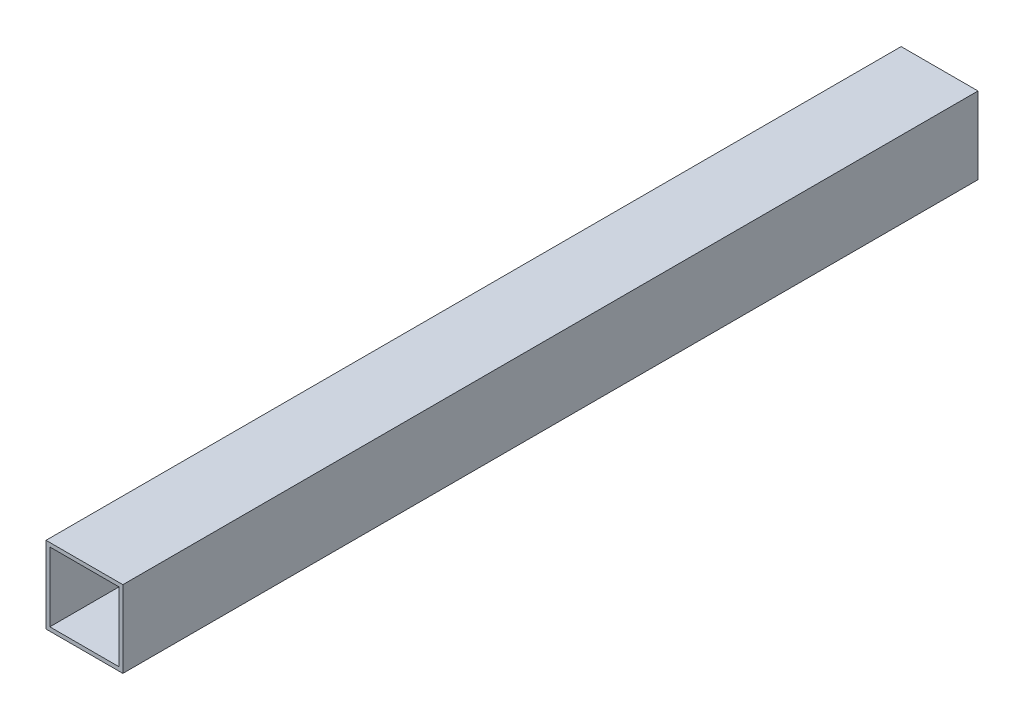
ISO-10303-21;
HEADER;
FILE_DESCRIPTION(('STEP AP214'),'2;1');
FILE_NAME('part.step','',(''),(''),'','','');
FILE_SCHEMA(('AUTOMOTIVE_DESIGN { 1 0 10303 214 1 1 1 1 }'));
ENDSEC;
DATA;
#1=APPLICATION_CONTEXT('core data for automotive mechanical design processes');
#2=APPLICATION_PROTOCOL_DEFINITION('international standard','automotive_design',2000,#1);
#3=PRODUCT_CONTEXT('',#1,'mechanical');
#4=PRODUCT('Part','Part','',(#3));
#5=PRODUCT_RELATED_PRODUCT_CATEGORY('part','',(#4));
#6=PRODUCT_DEFINITION_FORMATION('','',#4);
#7=PRODUCT_DEFINITION_CONTEXT('part definition',#1,'design');
#8=PRODUCT_DEFINITION('design','',#6,#7);
#9=PRODUCT_DEFINITION_SHAPE('','',#8);
#10=(LENGTH_UNIT() NAMED_UNIT(*) SI_UNIT(.MILLI.,.METRE.));
#11=(NAMED_UNIT(*) PLANE_ANGLE_UNIT() SI_UNIT($,.RADIAN.));
#12=(NAMED_UNIT(*) SI_UNIT($,.STERADIAN.) SOLID_ANGLE_UNIT());
#13=UNCERTAINTY_MEASURE_WITH_UNIT(LENGTH_MEASURE(1.E-05),#10,'distance_accuracy_value','');
#14=(GEOMETRIC_REPRESENTATION_CONTEXT(3) GLOBAL_UNCERTAINTY_ASSIGNED_CONTEXT((#13)) GLOBAL_UNIT_ASSIGNED_CONTEXT((#10,
#11,#12)) REPRESENTATION_CONTEXT('',''));
#15=CARTESIAN_POINT('',(0.,0.,0.));
#16=DIRECTION('',(0.,0.,1.));
#17=DIRECTION('',(1.,0.,0.));
#18=AXIS2_PLACEMENT_3D('',#15,#16,#17);
#19=CARTESIAN_POINT('',(-20.,-20.,-1545.));
#20=DIRECTION('',(0.,0.,-1.));
#21=DIRECTION('',(1.,0.,0.));
#22=AXIS2_PLACEMENT_3D('',#19,#20,#21);
#23=PLANE('',#22);
#24=DIRECTION('',(0.,-1.,0.));
#25=VECTOR('',#24,1.);
#26=CARTESIAN_POINT('',(-20.,-20.,-1545.));
#27=LINE('',#26,#25);
#28=CARTESIAN_POINT('',(-20.,20.,-1545.));
#29=VERTEX_POINT('',#28);
#30=CARTESIAN_POINT('',(-20.,-20.,-1545.));
#31=VERTEX_POINT('',#30);
#32=EDGE_CURVE('E129',#29,#31,#27,.T.);
#33=ORIENTED_EDGE('',*,*,#32,.F.);
#34=DIRECTION('',(-1.,0.,0.));
#35=VECTOR('',#34,1.);
#36=CARTESIAN_POINT('',(20.,20.,-1545.));
#37=LINE('',#36,#35);
#38=CARTESIAN_POINT('',(20.,20.,-1545.));
#39=VERTEX_POINT('',#38);
#40=EDGE_CURVE('E139',#39,#29,#37,.T.);
#41=ORIENTED_EDGE('',*,*,#40,.F.);
#42=DIRECTION('',(0.,1.,0.));
#43=VECTOR('',#42,1.);
#44=CARTESIAN_POINT('',(20.,-20.,-1545.));
#45=LINE('',#44,#43);
#46=CARTESIAN_POINT('',(20.,-20.,-1545.));
#47=VERTEX_POINT('',#46);
#48=EDGE_CURVE('E136',#47,#39,#45,.T.);
#49=ORIENTED_EDGE('',*,*,#48,.F.);
#50=DIRECTION('',(1.,0.,0.));
#51=VECTOR('',#50,1.);
#52=CARTESIAN_POINT('',(20.,-20.,-1545.));
#53=LINE('',#52,#51);
#54=EDGE_CURVE('E132',#31,#47,#53,.T.);
#55=ORIENTED_EDGE('',*,*,#54,.F.);
#56=EDGE_LOOP('',(#33,#41,#49,#55));
#57=FACE_BOUND('',#56,.T.);
#58=DIRECTION('',(1.,0.,0.));
#59=VECTOR('',#58,1.);
#60=CARTESIAN_POINT('',(20.,-18.,-1545.));
#61=LINE('',#60,#59);
#62=CARTESIAN_POINT('',(-18.,-18.,-1545.));
#63=VERTEX_POINT('',#62);
#64=CARTESIAN_POINT('',(18.,-18.,-1545.));
#65=VERTEX_POINT('',#64);
#66=EDGE_CURVE('E110',#63,#65,#61,.T.);
#67=ORIENTED_EDGE('',*,*,#66,.T.);
#68=DIRECTION('',(0.,1.,0.));
#69=VECTOR('',#68,1.);
#70=CARTESIAN_POINT('',(18.,-20.,-1545.));
#71=LINE('',#70,#69);
#72=CARTESIAN_POINT('',(18.,18.,-1545.));
#73=VERTEX_POINT('',#72);
#74=EDGE_CURVE('E115',#65,#73,#71,.T.);
#75=ORIENTED_EDGE('',*,*,#74,.T.);
#76=DIRECTION('',(-1.,0.,0.));
#77=VECTOR('',#76,1.);
#78=CARTESIAN_POINT('',(20.,18.,-1545.));
#79=LINE('',#78,#77);
#80=CARTESIAN_POINT('',(-18.,18.,-1545.));
#81=VERTEX_POINT('',#80);
#82=EDGE_CURVE('E111',#73,#81,#79,.T.);
#83=ORIENTED_EDGE('',*,*,#82,.T.);
#84=DIRECTION('',(0.,-1.,0.));
#85=VECTOR('',#84,1.);
#86=CARTESIAN_POINT('',(-18.,-20.,-1545.));
#87=LINE('',#86,#85);
#88=EDGE_CURVE('E96',#81,#63,#87,.T.);
#89=ORIENTED_EDGE('',*,*,#88,.T.);
#90=EDGE_LOOP('',(#67,#75,#83,#89));
#91=FACE_BOUND('',#90,.T.);
#92=ADVANCED_FACE('F30',(#57,#91),#23,.T.);
#93=CARTESIAN_POINT('',(-20.,-20.,-1100.));
#94=DIRECTION('',(0.,0.,-1.));
#95=DIRECTION('',(1.,0.,0.));
#96=AXIS2_PLACEMENT_3D('',#93,#94,#95);
#97=PLANE('',#96);
#98=DIRECTION('',(0.,-1.,0.));
#99=VECTOR('',#98,1.);
#100=CARTESIAN_POINT('',(-20.,-20.,-1100.));
#101=LINE('',#100,#99);
#102=CARTESIAN_POINT('',(-20.,20.,-1100.));
#103=VERTEX_POINT('',#102);
#104=CARTESIAN_POINT('',(-20.,-20.,-1100.));
#105=VERTEX_POINT('',#104);
#106=EDGE_CURVE('E104',#103,#105,#101,.T.);
#107=ORIENTED_EDGE('',*,*,#106,.T.);
#108=DIRECTION('',(1.,0.,0.));
#109=VECTOR('',#108,1.);
#110=CARTESIAN_POINT('',(20.,-20.,-1100.));
#111=LINE('',#110,#109);
#112=CARTESIAN_POINT('',(20.,-20.,-1100.));
#113=VERTEX_POINT('',#112);
#114=EDGE_CURVE('E145',#105,#113,#111,.T.);
#115=ORIENTED_EDGE('',*,*,#114,.T.);
#116=DIRECTION('',(0.,1.,0.));
#117=VECTOR('',#116,1.);
#118=CARTESIAN_POINT('',(20.,-20.,-1100.));
#119=LINE('',#118,#117);
#120=CARTESIAN_POINT('',(20.,20.,-1100.));
#121=VERTEX_POINT('',#120);
#122=EDGE_CURVE('E148',#113,#121,#119,.T.);
#123=ORIENTED_EDGE('',*,*,#122,.T.);
#124=DIRECTION('',(-1.,0.,0.));
#125=VECTOR('',#124,1.);
#126=CARTESIAN_POINT('',(20.,20.,-1100.));
#127=LINE('',#126,#125);
#128=EDGE_CURVE('E133',#121,#103,#127,.T.);
#129=ORIENTED_EDGE('',*,*,#128,.T.);
#130=EDGE_LOOP('',(#107,#115,#123,#129));
#131=FACE_BOUND('',#130,.T.);
#132=DIRECTION('',(0.,-1.,0.));
#133=VECTOR('',#132,1.);
#134=CARTESIAN_POINT('',(-18.,-20.,-1100.));
#135=LINE('',#134,#133);
#136=CARTESIAN_POINT('',(-18.,18.,-1100.));
#137=VERTEX_POINT('',#136);
#138=CARTESIAN_POINT('',(-18.,-18.,-1100.));
#139=VERTEX_POINT('',#138);
#140=EDGE_CURVE('E99',#137,#139,#135,.T.);
#141=ORIENTED_EDGE('',*,*,#140,.F.);
#142=DIRECTION('',(-1.,0.,0.));
#143=VECTOR('',#142,1.);
#144=CARTESIAN_POINT('',(20.,18.,-1100.));
#145=LINE('',#144,#143);
#146=CARTESIAN_POINT('',(18.,18.,-1100.));
#147=VERTEX_POINT('',#146);
#148=EDGE_CURVE('E112',#147,#137,#145,.T.);
#149=ORIENTED_EDGE('',*,*,#148,.F.);
#150=DIRECTION('',(0.,1.,0.));
#151=VECTOR('',#150,1.);
#152=CARTESIAN_POINT('',(18.,-20.,-1100.));
#153=LINE('',#152,#151);
#154=CARTESIAN_POINT('',(18.,-18.,-1100.));
#155=VERTEX_POINT('',#154);
#156=EDGE_CURVE('E123',#155,#147,#153,.T.);
#157=ORIENTED_EDGE('',*,*,#156,.F.);
#158=DIRECTION('',(1.,0.,0.));
#159=VECTOR('',#158,1.);
#160=CARTESIAN_POINT('',(20.,-18.,-1100.));
#161=LINE('',#160,#159);
#162=EDGE_CURVE('E121',#139,#155,#161,.T.);
#163=ORIENTED_EDGE('',*,*,#162,.F.);
#164=EDGE_LOOP('',(#141,#149,#157,#163));
#165=FACE_BOUND('',#164,.T.);
#166=ADVANCED_FACE('F165',(#131,#165),#97,.F.);
#167=CARTESIAN_POINT('',(-20.,-20.,-1545.));
#168=DIRECTION('',(1.,0.,0.));
#169=DIRECTION('',(0.,0.,1.));
#170=AXIS2_PLACEMENT_3D('',#167,#168,#169);
#171=PLANE('',#170);
#172=ORIENTED_EDGE('',*,*,#106,.F.);
#173=DIRECTION('',(0.,0.,1.));
#174=VECTOR('',#173,1.);
#175=CARTESIAN_POINT('',(-20.,20.,-1545.));
#176=LINE('',#175,#174);
#177=EDGE_CURVE('E142',#29,#103,#176,.T.);
#178=ORIENTED_EDGE('',*,*,#177,.F.);
#179=ORIENTED_EDGE('',*,*,#32,.T.);
#180=DIRECTION('',(0.,0.,1.));
#181=VECTOR('',#180,1.);
#182=CARTESIAN_POINT('',(-20.,-20.,-1545.));
#183=LINE('',#182,#181);
#184=EDGE_CURVE('E11',#31,#105,#183,.T.);
#185=ORIENTED_EDGE('',*,*,#184,.T.);
#186=EDGE_LOOP('',(#172,#178,#179,#185));
#187=FACE_BOUND('',#186,.T.);
#188=ADVANCED_FACE('F32',(#187),#171,.F.);
#189=CARTESIAN_POINT('',(20.,-20.,-1545.));
#190=DIRECTION('',(0.,1.,0.));
#191=DIRECTION('',(-1.,0.,0.));
#192=AXIS2_PLACEMENT_3D('',#189,#190,#191);
#193=PLANE('',#192);
#194=ORIENTED_EDGE('',*,*,#114,.F.);
#195=ORIENTED_EDGE('',*,*,#184,.F.);
#196=ORIENTED_EDGE('',*,*,#54,.T.);
#197=DIRECTION('',(0.,0.,1.));
#198=VECTOR('',#197,1.);
#199=CARTESIAN_POINT('',(20.,-20.,-1545.));
#200=LINE('',#199,#198);
#201=EDGE_CURVE('E38',#47,#113,#200,.T.);
#202=ORIENTED_EDGE('',*,*,#201,.T.);
#203=EDGE_LOOP('',(#194,#195,#196,#202));
#204=FACE_BOUND('',#203,.T.);
#205=ADVANCED_FACE('F158',(#204),#193,.F.);
#206=CARTESIAN_POINT('',(20.,-20.,-1545.));
#207=DIRECTION('',(-1.,0.,0.));
#208=DIRECTION('',(0.,0.,-1.));
#209=AXIS2_PLACEMENT_3D('',#206,#207,#208);
#210=PLANE('',#209);
#211=ORIENTED_EDGE('',*,*,#122,.F.);
#212=ORIENTED_EDGE('',*,*,#201,.F.);
#213=ORIENTED_EDGE('',*,*,#48,.T.);
#214=DIRECTION('',(0.,0.,1.));
#215=VECTOR('',#214,1.);
#216=CARTESIAN_POINT('',(20.,20.,-1545.));
#217=LINE('',#216,#215);
#218=EDGE_CURVE('E154',#39,#121,#217,.T.);
#219=ORIENTED_EDGE('',*,*,#218,.T.);
#220=EDGE_LOOP('',(#211,#212,#213,#219));
#221=FACE_BOUND('',#220,.T.);
#222=ADVANCED_FACE('F162',(#221),#210,.F.);
#223=CARTESIAN_POINT('',(20.,20.,-1545.));
#224=DIRECTION('',(0.,-1.,0.));
#225=DIRECTION('',(1.,0.,0.));
#226=AXIS2_PLACEMENT_3D('',#223,#224,#225);
#227=PLANE('',#226);
#228=ORIENTED_EDGE('',*,*,#128,.F.);
#229=ORIENTED_EDGE('',*,*,#218,.F.);
#230=ORIENTED_EDGE('',*,*,#40,.T.);
#231=ORIENTED_EDGE('',*,*,#177,.T.);
#232=EDGE_LOOP('',(#228,#229,#230,#231));
#233=FACE_BOUND('',#232,.T.);
#234=ADVANCED_FACE('F173',(#233),#227,.F.);
#235=CARTESIAN_POINT('',(-18.,-20.,-1545.));
#236=DIRECTION('',(1.,0.,0.));
#237=DIRECTION('',(0.,0.,1.));
#238=AXIS2_PLACEMENT_3D('',#235,#236,#237);
#239=PLANE('',#238);
#240=ORIENTED_EDGE('',*,*,#140,.T.);
#241=DIRECTION('',(0.,0.,1.));
#242=VECTOR('',#241,1.);
#243=CARTESIAN_POINT('',(-18.,-18.,-1545.));
#244=LINE('',#243,#242);
#245=EDGE_CURVE('E93',#63,#139,#244,.T.);
#246=ORIENTED_EDGE('',*,*,#245,.F.);
#247=ORIENTED_EDGE('',*,*,#88,.F.);
#248=DIRECTION('',(0.,0.,1.));
#249=VECTOR('',#248,1.);
#250=CARTESIAN_POINT('',(-18.,18.,-1545.));
#251=LINE('',#250,#249);
#252=EDGE_CURVE('E53',#81,#137,#251,.T.);
#253=ORIENTED_EDGE('',*,*,#252,.T.);
#254=EDGE_LOOP('',(#240,#246,#247,#253));
#255=FACE_BOUND('',#254,.T.);
#256=ADVANCED_FACE('F95',(#255),#239,.T.);
#257=CARTESIAN_POINT('',(20.,-18.,-1545.));
#258=DIRECTION('',(0.,1.,0.));
#259=DIRECTION('',(-1.,0.,0.));
#260=AXIS2_PLACEMENT_3D('',#257,#258,#259);
#261=PLANE('',#260);
#262=ORIENTED_EDGE('',*,*,#162,.T.);
#263=DIRECTION('',(0.,0.,1.));
#264=VECTOR('',#263,1.);
#265=CARTESIAN_POINT('',(18.,-18.,-1545.));
#266=LINE('',#265,#264);
#267=EDGE_CURVE('E105',#65,#155,#266,.T.);
#268=ORIENTED_EDGE('',*,*,#267,.F.);
#269=ORIENTED_EDGE('',*,*,#66,.F.);
#270=ORIENTED_EDGE('',*,*,#245,.T.);
#271=EDGE_LOOP('',(#262,#268,#269,#270));
#272=FACE_BOUND('',#271,.T.);
#273=ADVANCED_FACE('F114',(#272),#261,.T.);
#274=CARTESIAN_POINT('',(18.,-20.,-1545.));
#275=DIRECTION('',(-1.,0.,0.));
#276=DIRECTION('',(0.,0.,-1.));
#277=AXIS2_PLACEMENT_3D('',#274,#275,#276);
#278=PLANE('',#277);
#279=ORIENTED_EDGE('',*,*,#156,.T.);
#280=DIRECTION('',(0.,0.,1.));
#281=VECTOR('',#280,1.);
#282=CARTESIAN_POINT('',(18.,18.,-1545.));
#283=LINE('',#282,#281);
#284=EDGE_CURVE('E45',#73,#147,#283,.T.);
#285=ORIENTED_EDGE('',*,*,#284,.F.);
#286=ORIENTED_EDGE('',*,*,#74,.F.);
#287=ORIENTED_EDGE('',*,*,#267,.T.);
#288=EDGE_LOOP('',(#279,#285,#286,#287));
#289=FACE_BOUND('',#288,.T.);
#290=ADVANCED_FACE('F191',(#289),#278,.T.);
#291=CARTESIAN_POINT('',(20.,18.,-1545.));
#292=DIRECTION('',(0.,-1.,0.));
#293=DIRECTION('',(1.,0.,0.));
#294=AXIS2_PLACEMENT_3D('',#291,#292,#293);
#295=PLANE('',#294);
#296=ORIENTED_EDGE('',*,*,#148,.T.);
#297=ORIENTED_EDGE('',*,*,#252,.F.);
#298=ORIENTED_EDGE('',*,*,#82,.F.);
#299=ORIENTED_EDGE('',*,*,#284,.T.);
#300=EDGE_LOOP('',(#296,#297,#298,#299));
#301=FACE_BOUND('',#300,.T.);
#302=ADVANCED_FACE('F194',(#301),#295,.T.);
#303=CLOSED_SHELL('',(#92,#166,#188,#205,#222,#234,#256,#273,#290,#302));
#304=MANIFOLD_SOLID_BREP('B2',#303);
#305=ADVANCED_BREP_SHAPE_REPRESENTATION('',(#18,#304),#14);
#306=SHAPE_DEFINITION_REPRESENTATION(#9,#305);
ENDSEC;
END-ISO-10303-21;
